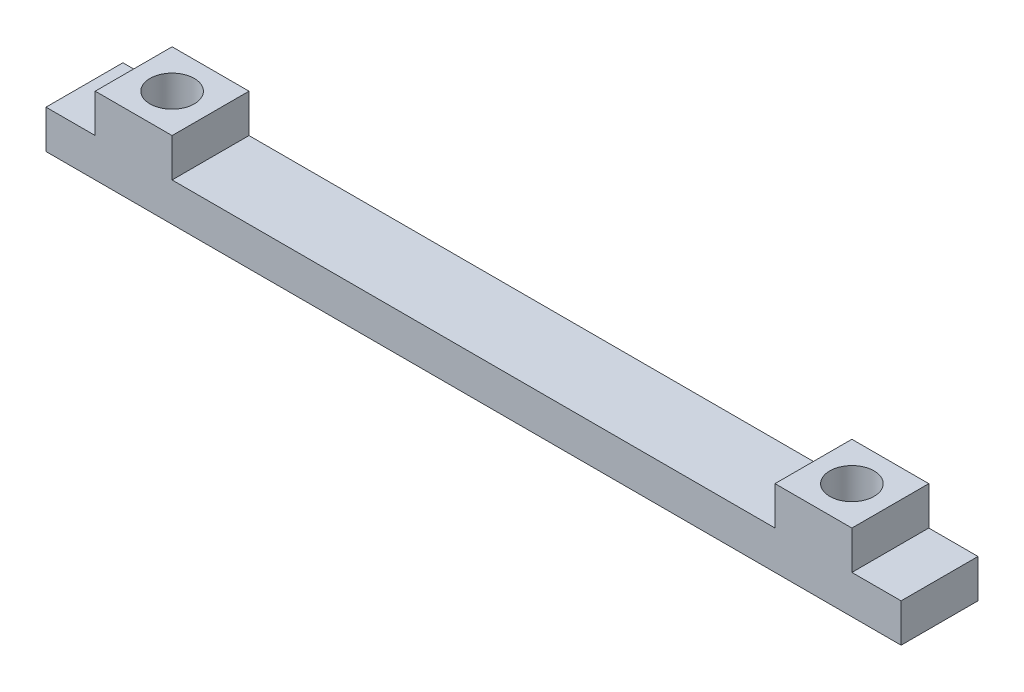
ISO-10303-21;
HEADER;
FILE_DESCRIPTION(('STEP AP214'),'2;1');
FILE_NAME('part.step','',(''),(''),'','','');
FILE_SCHEMA(('AUTOMOTIVE_DESIGN { 1 0 10303 214 1 1 1 1 }'));
ENDSEC;
DATA;
#1=APPLICATION_CONTEXT('core data for automotive mechanical design processes');
#2=APPLICATION_PROTOCOL_DEFINITION('international standard','automotive_design',2000,#1);
#3=PRODUCT_CONTEXT('',#1,'mechanical');
#4=PRODUCT('Part','Part','',(#3));
#5=PRODUCT_RELATED_PRODUCT_CATEGORY('part','',(#4));
#6=PRODUCT_DEFINITION_FORMATION('','',#4);
#7=PRODUCT_DEFINITION_CONTEXT('part definition',#1,'design');
#8=PRODUCT_DEFINITION('design','',#6,#7);
#9=PRODUCT_DEFINITION_SHAPE('','',#8);
#10=(LENGTH_UNIT() NAMED_UNIT(*) SI_UNIT(.MILLI.,.METRE.));
#11=(NAMED_UNIT(*) PLANE_ANGLE_UNIT() SI_UNIT($,.RADIAN.));
#12=(NAMED_UNIT(*) SI_UNIT($,.STERADIAN.) SOLID_ANGLE_UNIT());
#13=UNCERTAINTY_MEASURE_WITH_UNIT(LENGTH_MEASURE(1.E-05),#10,'distance_accuracy_value','');
#14=(GEOMETRIC_REPRESENTATION_CONTEXT(3) GLOBAL_UNCERTAINTY_ASSIGNED_CONTEXT((#13)) GLOBAL_UNIT_ASSIGNED_CONTEXT((#10,
#11,#12)) REPRESENTATION_CONTEXT('',''));
#15=CARTESIAN_POINT('',(0.,0.,0.));
#16=DIRECTION('',(0.,0.,1.));
#17=DIRECTION('',(1.,0.,0.));
#18=AXIS2_PLACEMENT_3D('',#15,#16,#17);
#19=CARTESIAN_POINT('',(0.,0.,6.35));
#20=DIRECTION('',(0.,1.,0.));
#21=DIRECTION('',(0.,0.,1.));
#22=AXIS2_PLACEMENT_3D('',#19,#20,#21);
#23=PLANE('',#22);
#24=CARTESIAN_POINT('',(7.239,0.,3.175));
#25=DIRECTION('',(0.,-1.,0.));
#26=DIRECTION('',(0.,0.,-1.));
#27=AXIS2_PLACEMENT_3D('',#24,#25,#26);
#28=CIRCLE('',#27,1.8288);
#29=CARTESIAN_POINT('',(7.239,0.,1.3462));
#30=VERTEX_POINT('',#29);
#31=EDGE_CURVE('E186',#30,#30,#28,.T.);
#32=ORIENTED_EDGE('',*,*,#31,.F.);
#33=EDGE_LOOP('',(#32));
#34=FACE_BOUND('',#33,.T.);
#35=CARTESIAN_POINT('',(63.373,0.,3.175));
#36=DIRECTION('',(0.,-1.,0.));
#37=DIRECTION('',(0.,0.,-1.));
#38=AXIS2_PLACEMENT_3D('',#35,#36,#37);
#39=CIRCLE('',#38,1.82880000000001);
#40=CARTESIAN_POINT('',(63.373,0.,1.34619999999999));
#41=VERTEX_POINT('',#40);
#42=EDGE_CURVE('E180',#41,#41,#39,.T.);
#43=ORIENTED_EDGE('',*,*,#42,.F.);
#44=EDGE_LOOP('',(#43));
#45=FACE_BOUND('',#44,.T.);
#46=DIRECTION('',(1.,0.,0.));
#47=VECTOR('',#46,1.);
#48=CARTESIAN_POINT('',(0.,0.,0.));
#49=LINE('',#48,#47);
#50=CARTESIAN_POINT('',(0.,0.,0.));
#51=VERTEX_POINT('',#50);
#52=CARTESIAN_POINT('',(70.612,0.,0.));
#53=VERTEX_POINT('',#52);
#54=EDGE_CURVE('E179',#51,#53,#49,.T.);
#55=ORIENTED_EDGE('',*,*,#54,.T.);
#56=DIRECTION('',(0.,0.,-1.));
#57=VECTOR('',#56,1.);
#58=CARTESIAN_POINT('',(70.612,0.,6.35));
#59=LINE('',#58,#57);
#60=CARTESIAN_POINT('',(70.612,0.,6.35));
#61=VERTEX_POINT('',#60);
#62=EDGE_CURVE('E11',#61,#53,#59,.T.);
#63=ORIENTED_EDGE('',*,*,#62,.F.);
#64=DIRECTION('',(1.,0.,0.));
#65=VECTOR('',#64,1.);
#66=CARTESIAN_POINT('',(0.,0.,6.35));
#67=LINE('',#66,#65);
#68=CARTESIAN_POINT('',(0.,0.,6.35));
#69=VERTEX_POINT('',#68);
#70=EDGE_CURVE('E173',#69,#61,#67,.T.);
#71=ORIENTED_EDGE('',*,*,#70,.F.);
#72=DIRECTION('',(0.,0.,-1.));
#73=VECTOR('',#72,1.);
#74=CARTESIAN_POINT('',(0.,0.,6.35));
#75=LINE('',#74,#73);
#76=EDGE_CURVE('E50',#69,#51,#75,.T.);
#77=ORIENTED_EDGE('',*,*,#76,.T.);
#78=EDGE_LOOP('',(#55,#63,#71,#77));
#79=FACE_BOUND('',#78,.T.);
#80=ADVANCED_FACE('F34',(#34,#45,#79),#23,.F.);
#81=CARTESIAN_POINT('',(70.612,0.,6.35));
#82=DIRECTION('',(-1.,0.,0.));
#83=DIRECTION('',(0.,0.,1.));
#84=AXIS2_PLACEMENT_3D('',#81,#82,#83);
#85=PLANE('',#84);
#86=DIRECTION('',(0.,1.,0.));
#87=VECTOR('',#86,1.);
#88=CARTESIAN_POINT('',(70.612,0.,0.));
#89=LINE('',#88,#87);
#90=CARTESIAN_POINT('',(70.612,3.175,0.));
#91=VERTEX_POINT('',#90);
#92=EDGE_CURVE('E199',#53,#91,#89,.T.);
#93=ORIENTED_EDGE('',*,*,#92,.T.);
#94=DIRECTION('',(0.,0.,-1.));
#95=VECTOR('',#94,1.);
#96=CARTESIAN_POINT('',(70.612,3.175,6.35));
#97=LINE('',#96,#95);
#98=CARTESIAN_POINT('',(70.612,3.175,6.35));
#99=VERTEX_POINT('',#98);
#100=EDGE_CURVE('E42',#99,#91,#97,.T.);
#101=ORIENTED_EDGE('',*,*,#100,.F.);
#102=DIRECTION('',(0.,1.,0.));
#103=VECTOR('',#102,1.);
#104=CARTESIAN_POINT('',(70.612,0.,6.35));
#105=LINE('',#104,#103);
#106=EDGE_CURVE('E100',#61,#99,#105,.T.);
#107=ORIENTED_EDGE('',*,*,#106,.F.);
#108=ORIENTED_EDGE('',*,*,#62,.T.);
#109=EDGE_LOOP('',(#93,#101,#107,#108));
#110=FACE_BOUND('',#109,.T.);
#111=ADVANCED_FACE('F194',(#110),#85,.F.);
#112=CARTESIAN_POINT('',(0.,3.175,6.35));
#113=DIRECTION('',(0.,1.,0.));
#114=DIRECTION('',(0.,0.,1.));
#115=AXIS2_PLACEMENT_3D('',#112,#113,#114);
#116=PLANE('',#115);
#117=DIRECTION('',(1.,0.,0.));
#118=VECTOR('',#117,1.);
#119=CARTESIAN_POINT('',(0.,3.175,0.));
#120=LINE('',#119,#118);
#121=CARTESIAN_POINT('',(66.548,3.175,0.));
#122=VERTEX_POINT('',#121);
#123=EDGE_CURVE('E202',#122,#91,#120,.T.);
#124=ORIENTED_EDGE('',*,*,#123,.F.);
#125=DIRECTION('',(0.,0.,-1.));
#126=VECTOR('',#125,1.);
#127=CARTESIAN_POINT('',(66.548,3.175,6.35));
#128=LINE('',#127,#126);
#129=CARTESIAN_POINT('',(66.548,3.175,6.35));
#130=VERTEX_POINT('',#129);
#131=EDGE_CURVE('E241',#130,#122,#128,.T.);
#132=ORIENTED_EDGE('',*,*,#131,.F.);
#133=DIRECTION('',(1.,0.,0.));
#134=VECTOR('',#133,1.);
#135=CARTESIAN_POINT('',(0.,3.175,6.35));
#136=LINE('',#135,#134);
#137=EDGE_CURVE('E169',#130,#99,#136,.T.);
#138=ORIENTED_EDGE('',*,*,#137,.T.);
#139=ORIENTED_EDGE('',*,*,#100,.T.);
#140=EDGE_LOOP('',(#124,#132,#138,#139));
#141=FACE_BOUND('',#140,.T.);
#142=ADVANCED_FACE('F244',(#141),#116,.T.);
#143=CARTESIAN_POINT('',(66.548,0.,6.35));
#144=DIRECTION('',(-1.,0.,0.));
#145=DIRECTION('',(0.,0.,1.));
#146=AXIS2_PLACEMENT_3D('',#143,#144,#145);
#147=PLANE('',#146);
#148=DIRECTION('',(0.,1.,0.));
#149=VECTOR('',#148,1.);
#150=CARTESIAN_POINT('',(66.548,0.,0.));
#151=LINE('',#150,#149);
#152=CARTESIAN_POINT('',(66.548,6.35,0.));
#153=VERTEX_POINT('',#152);
#154=EDGE_CURVE('E207',#122,#153,#151,.T.);
#155=ORIENTED_EDGE('',*,*,#154,.T.);
#156=DIRECTION('',(0.,0.,-1.));
#157=VECTOR('',#156,1.);
#158=CARTESIAN_POINT('',(66.548,6.35,6.35));
#159=LINE('',#158,#157);
#160=CARTESIAN_POINT('',(66.548,6.35,6.35));
#161=VERTEX_POINT('',#160);
#162=EDGE_CURVE('E239',#161,#153,#159,.T.);
#163=ORIENTED_EDGE('',*,*,#162,.F.);
#164=DIRECTION('',(0.,1.,0.));
#165=VECTOR('',#164,1.);
#166=CARTESIAN_POINT('',(66.548,0.,6.35));
#167=LINE('',#166,#165);
#168=EDGE_CURVE('E165',#130,#161,#167,.T.);
#169=ORIENTED_EDGE('',*,*,#168,.F.);
#170=ORIENTED_EDGE('',*,*,#131,.T.);
#171=EDGE_LOOP('',(#155,#163,#169,#170));
#172=FACE_BOUND('',#171,.T.);
#173=ADVANCED_FACE('F251',(#172),#147,.F.);
#174=CARTESIAN_POINT('',(0.,6.35,6.35));
#175=DIRECTION('',(0.,1.,0.));
#176=DIRECTION('',(0.,0.,1.));
#177=AXIS2_PLACEMENT_3D('',#174,#175,#176);
#178=PLANE('',#177);
#179=CARTESIAN_POINT('',(63.373,6.35,3.175));
#180=DIRECTION('',(0.,-1.,0.));
#181=DIRECTION('',(0.,0.,-1.));
#182=AXIS2_PLACEMENT_3D('',#179,#180,#181);
#183=CIRCLE('',#182,1.82879999999999);
#184=CARTESIAN_POINT('',(63.373,6.35,1.34620000000001));
#185=VERTEX_POINT('',#184);
#186=EDGE_CURVE('E176',#185,#185,#183,.T.);
#187=ORIENTED_EDGE('',*,*,#186,.T.);
#188=EDGE_LOOP('',(#187));
#189=FACE_BOUND('',#188,.T.);
#190=DIRECTION('',(1.,0.,0.));
#191=VECTOR('',#190,1.);
#192=CARTESIAN_POINT('',(0.,6.35,0.));
#193=LINE('',#192,#191);
#194=CARTESIAN_POINT('',(60.198,6.35,0.));
#195=VERTEX_POINT('',#194);
#196=EDGE_CURVE('E210',#195,#153,#193,.T.);
#197=ORIENTED_EDGE('',*,*,#196,.F.);
#198=DIRECTION('',(0.,0.,-1.));
#199=VECTOR('',#198,1.);
#200=CARTESIAN_POINT('',(60.198,6.35,6.35));
#201=LINE('',#200,#199);
#202=CARTESIAN_POINT('',(60.198,6.35,6.35));
#203=VERTEX_POINT('',#202);
#204=EDGE_CURVE('E237',#203,#195,#201,.T.);
#205=ORIENTED_EDGE('',*,*,#204,.F.);
#206=DIRECTION('',(1.,0.,0.));
#207=VECTOR('',#206,1.);
#208=CARTESIAN_POINT('',(0.,6.35,6.35));
#209=LINE('',#208,#207);
#210=EDGE_CURVE('E161',#203,#161,#209,.T.);
#211=ORIENTED_EDGE('',*,*,#210,.T.);
#212=ORIENTED_EDGE('',*,*,#162,.T.);
#213=EDGE_LOOP('',(#197,#205,#211,#212));
#214=FACE_BOUND('',#213,.T.);
#215=ADVANCED_FACE('F279',(#189,#214),#178,.T.);
#216=CARTESIAN_POINT('',(60.198,0.,6.35));
#217=DIRECTION('',(-1.,0.,0.));
#218=DIRECTION('',(0.,0.,1.));
#219=AXIS2_PLACEMENT_3D('',#216,#217,#218);
#220=PLANE('',#219);
#221=DIRECTION('',(0.,1.,0.));
#222=VECTOR('',#221,1.);
#223=CARTESIAN_POINT('',(60.198,0.,0.));
#224=LINE('',#223,#222);
#225=CARTESIAN_POINT('',(60.198,3.175,0.));
#226=VERTEX_POINT('',#225);
#227=EDGE_CURVE('E213',#226,#195,#224,.T.);
#228=ORIENTED_EDGE('',*,*,#227,.F.);
#229=DIRECTION('',(0.,0.,-1.));
#230=VECTOR('',#229,1.);
#231=CARTESIAN_POINT('',(60.198,3.175,6.35));
#232=LINE('',#231,#230);
#233=CARTESIAN_POINT('',(60.198,3.175,6.35));
#234=VERTEX_POINT('',#233);
#235=EDGE_CURVE('E235',#234,#226,#232,.T.);
#236=ORIENTED_EDGE('',*,*,#235,.F.);
#237=DIRECTION('',(0.,1.,0.));
#238=VECTOR('',#237,1.);
#239=CARTESIAN_POINT('',(60.198,0.,6.35));
#240=LINE('',#239,#238);
#241=EDGE_CURVE('E157',#234,#203,#240,.T.);
#242=ORIENTED_EDGE('',*,*,#241,.T.);
#243=ORIENTED_EDGE('',*,*,#204,.T.);
#244=EDGE_LOOP('',(#228,#236,#242,#243));
#245=FACE_BOUND('',#244,.T.);
#246=ADVANCED_FACE('F276',(#245),#220,.T.);
#247=CARTESIAN_POINT('',(0.,3.175,6.35));
#248=DIRECTION('',(0.,1.,0.));
#249=DIRECTION('',(0.,0.,1.));
#250=AXIS2_PLACEMENT_3D('',#247,#248,#249);
#251=PLANE('',#250);
#252=DIRECTION('',(1.,0.,0.));
#253=VECTOR('',#252,1.);
#254=CARTESIAN_POINT('',(0.,3.175,0.));
#255=LINE('',#254,#253);
#256=CARTESIAN_POINT('',(10.414,3.175,0.));
#257=VERTEX_POINT('',#256);
#258=EDGE_CURVE('E216',#257,#226,#255,.T.);
#259=ORIENTED_EDGE('',*,*,#258,.F.);
#260=DIRECTION('',(0.,0.,-1.));
#261=VECTOR('',#260,1.);
#262=CARTESIAN_POINT('',(10.414,3.175,6.35));
#263=LINE('',#262,#261);
#264=CARTESIAN_POINT('',(10.414,3.175,6.35));
#265=VERTEX_POINT('',#264);
#266=EDGE_CURVE('E233',#265,#257,#263,.T.);
#267=ORIENTED_EDGE('',*,*,#266,.F.);
#268=DIRECTION('',(1.,0.,0.));
#269=VECTOR('',#268,1.);
#270=CARTESIAN_POINT('',(0.,3.175,6.35));
#271=LINE('',#270,#269);
#272=EDGE_CURVE('E151',#265,#234,#271,.T.);
#273=ORIENTED_EDGE('',*,*,#272,.T.);
#274=ORIENTED_EDGE('',*,*,#235,.T.);
#275=EDGE_LOOP('',(#259,#267,#273,#274));
#276=FACE_BOUND('',#275,.T.);
#277=ADVANCED_FACE('F263',(#276),#251,.T.);
#278=CARTESIAN_POINT('',(10.414,0.,6.35));
#279=DIRECTION('',(-1.,0.,0.));
#280=DIRECTION('',(0.,0.,1.));
#281=AXIS2_PLACEMENT_3D('',#278,#279,#280);
#282=PLANE('',#281);
#283=DIRECTION('',(0.,1.,0.));
#284=VECTOR('',#283,1.);
#285=CARTESIAN_POINT('',(10.414,0.,0.));
#286=LINE('',#285,#284);
#287=CARTESIAN_POINT('',(10.414,6.35,0.));
#288=VERTEX_POINT('',#287);
#289=EDGE_CURVE('E219',#257,#288,#286,.T.);
#290=ORIENTED_EDGE('',*,*,#289,.T.);
#291=DIRECTION('',(0.,0.,-1.));
#292=VECTOR('',#291,1.);
#293=CARTESIAN_POINT('',(10.414,6.35,6.35));
#294=LINE('',#293,#292);
#295=CARTESIAN_POINT('',(10.414,6.35,6.35));
#296=VERTEX_POINT('',#295);
#297=EDGE_CURVE('E231',#296,#288,#294,.T.);
#298=ORIENTED_EDGE('',*,*,#297,.F.);
#299=DIRECTION('',(0.,1.,0.));
#300=VECTOR('',#299,1.);
#301=CARTESIAN_POINT('',(10.414,0.,6.35));
#302=LINE('',#301,#300);
#303=EDGE_CURVE('E156',#265,#296,#302,.T.);
#304=ORIENTED_EDGE('',*,*,#303,.F.);
#305=ORIENTED_EDGE('',*,*,#266,.T.);
#306=EDGE_LOOP('',(#290,#298,#304,#305));
#307=FACE_BOUND('',#306,.T.);
#308=ADVANCED_FACE('F271',(#307),#282,.F.);
#309=CARTESIAN_POINT('',(0.,6.35,6.35));
#310=DIRECTION('',(0.,1.,0.));
#311=DIRECTION('',(0.,0.,1.));
#312=AXIS2_PLACEMENT_3D('',#309,#310,#311);
#313=PLANE('',#312);
#314=CARTESIAN_POINT('',(7.239,6.35,3.175));
#315=DIRECTION('',(0.,-1.,0.));
#316=DIRECTION('',(0.,0.,-1.));
#317=AXIS2_PLACEMENT_3D('',#314,#315,#316);
#318=CIRCLE('',#317,1.8288);
#319=CARTESIAN_POINT('',(7.239,6.35,1.3462));
#320=VERTEX_POINT('',#319);
#321=EDGE_CURVE('E183',#320,#320,#318,.T.);
#322=ORIENTED_EDGE('',*,*,#321,.T.);
#323=EDGE_LOOP('',(#322));
#324=FACE_BOUND('',#323,.T.);
#325=DIRECTION('',(1.,0.,0.));
#326=VECTOR('',#325,1.);
#327=CARTESIAN_POINT('',(0.,6.35,0.));
#328=LINE('',#327,#326);
#329=CARTESIAN_POINT('',(4.064,6.35,0.));
#330=VERTEX_POINT('',#329);
#331=EDGE_CURVE('E223',#330,#288,#328,.T.);
#332=ORIENTED_EDGE('',*,*,#331,.F.);
#333=DIRECTION('',(0.,0.,-1.));
#334=VECTOR('',#333,1.);
#335=CARTESIAN_POINT('',(4.064,6.35,6.35));
#336=LINE('',#335,#334);
#337=CARTESIAN_POINT('',(4.064,6.35,6.35));
#338=VERTEX_POINT('',#337);
#339=EDGE_CURVE('E137',#338,#330,#336,.T.);
#340=ORIENTED_EDGE('',*,*,#339,.F.);
#341=DIRECTION('',(1.,0.,0.));
#342=VECTOR('',#341,1.);
#343=CARTESIAN_POINT('',(0.,6.35,6.35));
#344=LINE('',#343,#342);
#345=EDGE_CURVE('E146',#338,#296,#344,.T.);
#346=ORIENTED_EDGE('',*,*,#345,.T.);
#347=ORIENTED_EDGE('',*,*,#297,.T.);
#348=EDGE_LOOP('',(#332,#340,#346,#347));
#349=FACE_BOUND('',#348,.T.);
#350=ADVANCED_FACE('F268',(#324,#349),#313,.T.);
#351=CARTESIAN_POINT('',(4.064,0.,6.35));
#352=DIRECTION('',(-1.,0.,0.));
#353=DIRECTION('',(0.,0.,1.));
#354=AXIS2_PLACEMENT_3D('',#351,#352,#353);
#355=PLANE('',#354);
#356=DIRECTION('',(0.,1.,0.));
#357=VECTOR('',#356,1.);
#358=CARTESIAN_POINT('',(4.064,0.,0.));
#359=LINE('',#358,#357);
#360=CARTESIAN_POINT('',(4.064,3.175,0.));
#361=VERTEX_POINT('',#360);
#362=EDGE_CURVE('E133',#361,#330,#359,.T.);
#363=ORIENTED_EDGE('',*,*,#362,.F.);
#364=DIRECTION('',(0.,0.,-1.));
#365=VECTOR('',#364,1.);
#366=CARTESIAN_POINT('',(4.064,3.175,6.35));
#367=LINE('',#366,#365);
#368=CARTESIAN_POINT('',(4.064,3.175,6.35));
#369=VERTEX_POINT('',#368);
#370=EDGE_CURVE('E128',#369,#361,#367,.T.);
#371=ORIENTED_EDGE('',*,*,#370,.F.);
#372=DIRECTION('',(0.,1.,0.));
#373=VECTOR('',#372,1.);
#374=CARTESIAN_POINT('',(4.064,0.,6.35));
#375=LINE('',#374,#373);
#376=EDGE_CURVE('E131',#369,#338,#375,.T.);
#377=ORIENTED_EDGE('',*,*,#376,.T.);
#378=ORIENTED_EDGE('',*,*,#339,.T.);
#379=EDGE_LOOP('',(#363,#371,#377,#378));
#380=FACE_BOUND('',#379,.T.);
#381=ADVANCED_FACE('F130',(#380),#355,.T.);
#382=CARTESIAN_POINT('',(0.,3.175,0.));
#383=VERTEX_POINT('',#382);
#384=EDGE_CURVE('E220',#383,#361,#255,.T.);
#385=ORIENTED_EDGE('',*,*,#384,.F.);
#386=DIRECTION('',(0.,0.,-1.));
#387=VECTOR('',#386,1.);
#388=CARTESIAN_POINT('',(0.,3.175,6.35));
#389=LINE('',#388,#387);
#390=CARTESIAN_POINT('',(0.,3.175,6.35));
#391=VERTEX_POINT('',#390);
#392=EDGE_CURVE('E88',#391,#383,#389,.T.);
#393=ORIENTED_EDGE('',*,*,#392,.F.);
#394=EDGE_CURVE('E144',#391,#369,#271,.T.);
#395=ORIENTED_EDGE('',*,*,#394,.T.);
#396=ORIENTED_EDGE('',*,*,#370,.T.);
#397=EDGE_LOOP('',(#385,#393,#395,#396));
#398=FACE_BOUND('',#397,.T.);
#399=ADVANCED_FACE('F148',(#398),#251,.T.);
#400=CARTESIAN_POINT('',(0.,0.,6.35));
#401=DIRECTION('',(-1.,0.,0.));
#402=DIRECTION('',(0.,0.,1.));
#403=AXIS2_PLACEMENT_3D('',#400,#401,#402);
#404=PLANE('',#403);
#405=DIRECTION('',(0.,1.,0.));
#406=VECTOR('',#405,1.);
#407=CARTESIAN_POINT('',(0.,0.,0.));
#408=LINE('',#407,#406);
#409=EDGE_CURVE('E175',#51,#383,#408,.T.);
#410=ORIENTED_EDGE('',*,*,#409,.F.);
#411=ORIENTED_EDGE('',*,*,#76,.F.);
#412=DIRECTION('',(0.,1.,0.));
#413=VECTOR('',#412,1.);
#414=CARTESIAN_POINT('',(0.,0.,6.35));
#415=LINE('',#414,#413);
#416=EDGE_CURVE('E149',#69,#391,#415,.T.);
#417=ORIENTED_EDGE('',*,*,#416,.T.);
#418=ORIENTED_EDGE('',*,*,#392,.T.);
#419=EDGE_LOOP('',(#410,#411,#417,#418));
#420=FACE_BOUND('',#419,.T.);
#421=ADVANCED_FACE('F254',(#420),#404,.T.);
#422=CARTESIAN_POINT('',(0.,0.,6.35));
#423=DIRECTION('',(0.,0.,1.));
#424=DIRECTION('',(1.,0.,0.));
#425=AXIS2_PLACEMENT_3D('',#422,#423,#424);
#426=PLANE('',#425);
#427=ORIENTED_EDGE('',*,*,#70,.T.);
#428=ORIENTED_EDGE('',*,*,#106,.T.);
#429=ORIENTED_EDGE('',*,*,#137,.F.);
#430=ORIENTED_EDGE('',*,*,#168,.T.);
#431=ORIENTED_EDGE('',*,*,#210,.F.);
#432=ORIENTED_EDGE('',*,*,#241,.F.);
#433=ORIENTED_EDGE('',*,*,#272,.F.);
#434=ORIENTED_EDGE('',*,*,#303,.T.);
#435=ORIENTED_EDGE('',*,*,#345,.F.);
#436=ORIENTED_EDGE('',*,*,#376,.F.);
#437=ORIENTED_EDGE('',*,*,#394,.F.);
#438=ORIENTED_EDGE('',*,*,#416,.F.);
#439=EDGE_LOOP('',(#427,#428,#429,#430,#431,#432,#433,#434,#435,#436,#437,#438));
#440=FACE_BOUND('',#439,.T.);
#441=ADVANCED_FACE('F142',(#440),#426,.T.);
#442=CARTESIAN_POINT('',(0.,0.,0.));
#443=DIRECTION('',(0.,0.,1.));
#444=DIRECTION('',(1.,0.,0.));
#445=AXIS2_PLACEMENT_3D('',#442,#443,#444);
#446=PLANE('',#445);
#447=ORIENTED_EDGE('',*,*,#54,.F.);
#448=ORIENTED_EDGE('',*,*,#409,.T.);
#449=ORIENTED_EDGE('',*,*,#384,.T.);
#450=ORIENTED_EDGE('',*,*,#362,.T.);
#451=ORIENTED_EDGE('',*,*,#331,.T.);
#452=ORIENTED_EDGE('',*,*,#289,.F.);
#453=ORIENTED_EDGE('',*,*,#258,.T.);
#454=ORIENTED_EDGE('',*,*,#227,.T.);
#455=ORIENTED_EDGE('',*,*,#196,.T.);
#456=ORIENTED_EDGE('',*,*,#154,.F.);
#457=ORIENTED_EDGE('',*,*,#123,.T.);
#458=ORIENTED_EDGE('',*,*,#92,.F.);
#459=EDGE_LOOP('',(#447,#448,#449,#450,#451,#452,#453,#454,#455,#456,#457,#458));
#460=FACE_BOUND('',#459,.T.);
#461=ADVANCED_FACE('F247',(#460),#446,.F.);
#462=CARTESIAN_POINT('',(63.373,0.,3.175));
#463=DIRECTION('',(0.,-1.,0.));
#464=DIRECTION('',(0.,0.,-1.));
#465=AXIS2_PLACEMENT_3D('',#462,#463,#464);
#466=CYLINDRICAL_SURFACE('',#465,1.8288);
#467=ORIENTED_EDGE('',*,*,#186,.F.);
#468=EDGE_LOOP('',(#467));
#469=FACE_BOUND('',#468,.T.);
#470=ORIENTED_EDGE('',*,*,#42,.T.);
#471=EDGE_LOOP('',(#470));
#472=FACE_BOUND('',#471,.T.);
#473=ADVANCED_FACE('F351',(#469,#472),#466,.F.);
#474=CARTESIAN_POINT('',(7.239,0.,3.175));
#475=DIRECTION('',(0.,-1.,0.));
#476=DIRECTION('',(0.,0.,-1.));
#477=AXIS2_PLACEMENT_3D('',#474,#475,#476);
#478=CYLINDRICAL_SURFACE('',#477,1.8288);
#479=ORIENTED_EDGE('',*,*,#321,.F.);
#480=EDGE_LOOP('',(#479));
#481=FACE_BOUND('',#480,.T.);
#482=ORIENTED_EDGE('',*,*,#31,.T.);
#483=EDGE_LOOP('',(#482));
#484=FACE_BOUND('',#483,.T.);
#485=ADVANCED_FACE('F190',(#481,#484),#478,.F.);
#486=CLOSED_SHELL('',(#80,#111,#142,#173,#215,#246,#277,#308,#350,#381,#399,#421,#441,#461,#473,#485));
#487=MANIFOLD_SOLID_BREP('B2',#486);
#488=ADVANCED_BREP_SHAPE_REPRESENTATION('',(#18,#487),#14);
#489=SHAPE_DEFINITION_REPRESENTATION(#9,#488);
ENDSEC;
END-ISO-10303-21;
